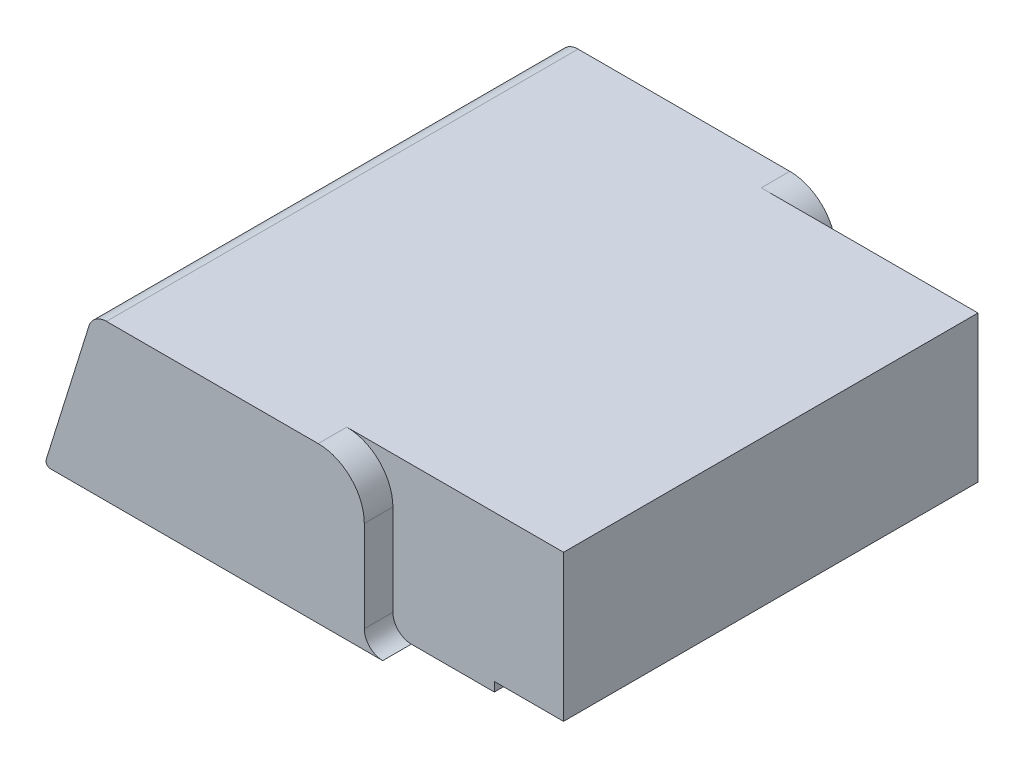
ISO-10303-21;
HEADER;
FILE_DESCRIPTION(('STEP AP214'),'2;1');
FILE_NAME('part.step','',(''),(''),'','','');
FILE_SCHEMA(('AUTOMOTIVE_DESIGN { 1 0 10303 214 1 1 1 1 }'));
ENDSEC;
DATA;
#1=APPLICATION_CONTEXT('core data for automotive mechanical design processes');
#2=APPLICATION_PROTOCOL_DEFINITION('international standard','automotive_design',2000,#1);
#3=PRODUCT_CONTEXT('',#1,'mechanical');
#4=PRODUCT('Part','Part','',(#3));
#5=PRODUCT_RELATED_PRODUCT_CATEGORY('part','',(#4));
#6=PRODUCT_DEFINITION_FORMATION('','',#4);
#7=PRODUCT_DEFINITION_CONTEXT('part definition',#1,'design');
#8=PRODUCT_DEFINITION('design','',#6,#7);
#9=PRODUCT_DEFINITION_SHAPE('','',#8);
#10=(LENGTH_UNIT() NAMED_UNIT(*) SI_UNIT(.MILLI.,.METRE.));
#11=(NAMED_UNIT(*) PLANE_ANGLE_UNIT() SI_UNIT($,.RADIAN.));
#12=(NAMED_UNIT(*) SI_UNIT($,.STERADIAN.) SOLID_ANGLE_UNIT());
#13=UNCERTAINTY_MEASURE_WITH_UNIT(LENGTH_MEASURE(1.E-05),#10,'distance_accuracy_value','');
#14=(GEOMETRIC_REPRESENTATION_CONTEXT(3) GLOBAL_UNCERTAINTY_ASSIGNED_CONTEXT((#13)) GLOBAL_UNIT_ASSIGNED_CONTEXT((#10,
#11,#12)) REPRESENTATION_CONTEXT('',''));
#15=CARTESIAN_POINT('',(0.,0.,0.));
#16=DIRECTION('',(0.,0.,1.));
#17=DIRECTION('',(1.,0.,0.));
#18=AXIS2_PLACEMENT_3D('',#15,#16,#17);
#19=CARTESIAN_POINT('',(-101.281474123743,-37.0815724734744,164.417656484885));
#20=CARTESIAN_POINT('',(-101.281474123743,-37.2137601819587,164.417656484885));
#21=CARTESIAN_POINT('',(-101.268497838334,-37.3437382004866,164.417656612879));
#22=CARTESIAN_POINT('',(-101.217653693146,-37.599455461755,164.417657114393));
#23=CARTESIAN_POINT('',(-101.179167805095,-37.7265205122736,164.417657494007));
#24=CARTESIAN_POINT('',(-101.078697982365,-37.9688073408026,164.417658485015));
#25=CARTESIAN_POINT('',(-101.017216946003,-38.0837169453513,164.417659091448));
#26=CARTESIAN_POINT('',(-100.871965630186,-38.3011763139347,164.417660524168));
#27=CARTESIAN_POINT('',(-100.787426051706,-38.4041223533585,164.417661358044));
#28=CARTESIAN_POINT('',(-100.510489943117,-38.6808339691759,164.417664089669));
#29=CARTESIAN_POINT('',(-100.287293627809,-38.8297238628878,164.417666291218));
#30=CARTESIAN_POINT('',(-99.8065075250648,-39.0288901593599,164.417671033566));
#31=CARTESIAN_POINT('',(-99.544520672811,-39.0815724734744,164.417673617735));
#32=CARTESIAN_POINT('',(-99.2814751127898,-39.0815724734744,164.417676212346));
#33=B_SPLINE_CURVE_WITH_KNOTS('',3,(#19,#20,#21,#22,#23,#24,#25,#26,#27,#28,#29,#30,#31,#32),
.UNSPECIFIED.,.F.,.F.,(4,2,2,2,2,2,4),(0.,0.125000000000002,0.250000000000005,0.375000000000007,
0.500000000000009,0.750000000000005,1.),.UNSPECIFIED.);
#34=DIRECTION('',(9.86373575134302E-06,0.,-0.999999999951353));
#35=VECTOR('',#34,1.);
#36=SURFACE_OF_LINEAR_EXTRUSION('',#33,#35);
#37=CARTESIAN_POINT('',(-99.2806044038107,-39.0815724734744,76.1439226375923));
#38=CARTESIAN_POINT('',(-99.3367784168037,-39.0815715984318,76.1439226375924));
#39=CARTESIAN_POINT('',(-99.3929471010851,-39.0791697772027,76.1439226375924));
#40=CARTESIAN_POINT('',(-99.5048902738677,-39.0696491265794,76.1439226375924));
#41=CARTESIAN_POINT('',(-99.5606647180303,-39.0625297748922,76.1439226375924));
#42=CARTESIAN_POINT('',(-99.6713546085651,-39.0436706820507,76.1439226375924));
#43=CARTESIAN_POINT('',(-99.7262710340785,-39.0319366794698,76.1439226375924));
#44=CARTESIAN_POINT('',(-99.834929594132,-39.0039271506319,76.1439226375923));
#45=CARTESIAN_POINT('',(-99.88867181901,-38.987651975089,76.1439226375923));
#46=CARTESIAN_POINT('',(-99.9946258689772,-38.9506075506168,76.1439226375923));
#47=CARTESIAN_POINT('',(-100.046836696861,-38.9298354440736,76.1439226375923));
#48=CARTESIAN_POINT('',(-100.149286783876,-38.8838922989977,76.1439226375924));
#49=CARTESIAN_POINT('',(-100.199525957019,-38.8587210688703,76.1439226375924));
#50=CARTESIAN_POINT('',(-100.29773897228,-38.8042714427134,76.1439226375924));
#51=CARTESIAN_POINT('',(-100.345712302541,-38.7749921245376,76.1439226375924));
#52=CARTESIAN_POINT('',(-100.43906449087,-38.7125540074626,76.1439226375923));
#53=CARTESIAN_POINT('',(-100.484443241201,-38.679395047639,76.1439226375923));
#54=CARTESIAN_POINT('',(-100.577030285781,-38.6056169910822,76.1439226375923));
#55=CARTESIAN_POINT('',(-100.62390632032,-38.5645789451913,76.1439226375923));
#56=CARTESIAN_POINT('',(-100.713535178313,-38.4782185877929,76.1439226375924));
#57=CARTESIAN_POINT('',(-100.756287491258,-38.4328957472098,76.1439226375924));
#58=CARTESIAN_POINT('',(-100.837439567959,-38.338509501545,76.1439226375924));
#59=CARTESIAN_POINT('',(-100.875839507396,-38.2894462475764,76.1439226375924));
#60=CARTESIAN_POINT('',(-100.947891403954,-38.1879421548522,76.1439226375924));
#61=CARTESIAN_POINT('',(-100.981541988551,-38.135500346074,76.1439226375923));
#62=CARTESIAN_POINT('',(-101.068887837804,-37.9842031491238,76.1439226375923));
#63=CARTESIAN_POINT('',(-101.11689395935,-37.8819892549647,76.1439226375924));
#64=CARTESIAN_POINT('',(-101.195024336623,-37.6710846905227,76.1439226375923));
#65=CARTESIAN_POINT('',(-101.22516959918,-37.5624017949772,76.1439226375923));
#66=CARTESIAN_POINT('',(-101.257519046321,-37.3909555321711,76.1439226375923));
#67=CARTESIAN_POINT('',(-101.266188972902,-37.3293502797344,76.1439226375924));
#68=CARTESIAN_POINT('',(-101.277739115154,-37.2056963047241,76.1439226375924));
#69=CARTESIAN_POINT('',(-101.280628304866,-37.1436484198286,76.1439226375923));
#70=CARTESIAN_POINT('',(-101.280603414959,-37.0815724734744,76.1439226375922));
#71=B_SPLINE_CURVE_WITH_KNOTS('',3,(#37,#38,#39,#40,#41,#42,#43,#44,#45,#46,#47,#48,#49,#50,#51,
#52,#53,#54,#55,#56,#57,#58,#59,#60,#61,#62,#63,#64,#65,#66,#67,#68,#69,#70),.UNSPECIFIED.,.F.,
.F.,(4,2,2,2,2,2,2,2,2,2,2,2,2,2,2,2,4),(0.,0.168463527425726,0.336945709105961,
0.505219033042758,0.673479364849754,0.84184693464676,1.01022183916789,1.17863459960835,
1.34705434815637,1.5336751012885,1.7203189280555,1.90695521838587,2.09364533506382,
2.43072316860925,2.76740376115721,2.95379652718704,3.13989971108254),.UNSPECIFIED.);
#72=CARTESIAN_POINT('',(-99.2806044038107,-39.0815724734744,76.1439226375924));
#73=VERTEX_POINT('',#72);
#74=CARTESIAN_POINT('',(-101.280603414978,-37.0815724734744,76.1439226375924));
#75=VERTEX_POINT('',#74);
#76=EDGE_CURVE('E165',#73,#75,#71,.T.);
#77=ORIENTED_EDGE('',*,*,#76,.F.);
#78=DIRECTION('',(9.86373575134302E-06,0.,-0.999999999951353));
#79=VECTOR('',#78,1.);
#80=CARTESIAN_POINT('',(-99.2814751127898,-39.0815724734744,164.417676212346));
#81=LINE('',#80,#79);
#82=CARTESIAN_POINT('',(-99.2805738258406,-39.0815724734744,73.043883173301));
#83=VERTEX_POINT('',#82);
#84=EDGE_CURVE('E39',#73,#83,#81,.T.);
#85=ORIENTED_EDGE('',*,*,#84,.T.);
#86=CARTESIAN_POINT('',(-101.280572837378,-37.0815724734744,73.0439226282245));
#87=CARTESIAN_POINT('',(-101.280591551886,-37.1378284980693,73.0439226285937));
#88=CARTESIAN_POINT('',(-101.278222042697,-37.1940598038379,73.0439225818493));
#89=CARTESIAN_POINT('',(-101.268745643697,-37.3061154827762,73.0439223949039));
#90=CARTESIAN_POINT('',(-101.261639292978,-37.3619399015224,73.0439222547136));
#91=CARTESIAN_POINT('',(-101.233301660917,-37.5281164219867,73.0439216956837));
#92=CARTESIAN_POINT('',(-101.205051597739,-37.6373459178312,73.0439211383814));
#93=CARTESIAN_POINT('',(-101.130632392638,-37.8495893692544,73.0439196702787));
#94=CARTESIAN_POINT('',(-101.084453857574,-37.9526000338991,73.0439187592929));
#95=CARTESIAN_POINT('',(-101.002748687609,-38.1000914256358,73.0439171474565));
#96=CARTESIAN_POINT('',(-100.973429434884,-38.1480986006943,73.0439165690618));
#97=CARTESIAN_POINT('',(-100.91082276536,-38.2414700848887,73.0439153339905));
#98=CARTESIAN_POINT('',(-100.877535129304,-38.2868342477886,73.0439146773096));
#99=CARTESIAN_POINT('',(-100.807350677536,-38.3745868911596,73.0439132927478));
#100=CARTESIAN_POINT('',(-100.770458165198,-38.4169788183636,73.0439125649519));
#101=CARTESIAN_POINT('',(-100.693205085952,-38.4984727556882,73.0439110409439));
#102=CARTESIAN_POINT('',(-100.652844810534,-38.5375750417807,73.0439102447378));
#103=CARTESIAN_POINT('',(-100.568932693656,-38.6122112425541,73.0439085893639));
#104=CARTESIAN_POINT('',(-100.525380184739,-38.6477444072719,73.043907730183));
#105=CARTESIAN_POINT('',(-100.435486350699,-38.7150665989496,73.0439059568049));
#106=CARTESIAN_POINT('',(-100.38914472741,-38.7468552245257,73.0439050426019));
#107=CARTESIAN_POINT('',(-100.24610960078,-38.8364513125397,73.0439022208805));
#108=CARTESIAN_POINT('',(-100.145589476334,-38.8883262298092,73.0439002378726));
#109=CARTESIAN_POINT('',(-99.9372394287887,-38.9740727999361,73.043896127653));
#110=CARTESIAN_POINT('',(-99.8294140727153,-39.0079555859781,73.0438940005313));
#111=CARTESIAN_POINT('',(-99.6475498627048,-39.0488359712398,73.0438904128103));
#112=CARTESIAN_POINT('',(-99.5746438881906,-39.061072150641,73.0438889745598));
#113=CARTESIAN_POINT('',(-99.4280311750876,-39.0774322083513,73.0438860822617));
#114=CARTESIAN_POINT('',(-99.3543256832973,-39.0815672817259,73.0438846282387));
#115=CARTESIAN_POINT('',(-99.2805738258406,-39.0815724734744,73.043883173301));
#116=B_SPLINE_CURVE_WITH_KNOTS('',3,(#86,#87,#88,#89,#90,#91,#92,#93,#94,#95,#96,#97,#98,#99,
#100,#101,#102,#103,#104,#105,#106,#107,#108,#109,#110,#111,#112,#113,#114,#115),.UNSPECIFIED.,
.F.,.F.,(4,2,2,2,2,2,2,2,2,2,2,2,2,2,4),(0.,0.16866740805359,0.337315623609325,
0.674096401412206,1.01105386510752,1.17963983209892,1.34823511798416,1.51663154413684,
1.68501382920234,1.85343142197454,2.02186705132782,2.35946555505979,2.69685491518546,
2.91821729875072,3.13927356123856),.UNSPECIFIED.);
#117=CARTESIAN_POINT('',(-101.280572837378,-37.0815724734744,73.0439226282245));
#118=VERTEX_POINT('',#117);
#119=EDGE_CURVE('E312',#118,#83,#116,.T.);
#120=ORIENTED_EDGE('',*,*,#119,.F.);
#121=DIRECTION('',(9.86373575134302E-06,0.,-0.999999999951353));
#122=VECTOR('',#121,1.);
#123=CARTESIAN_POINT('',(-101.281474123743,-37.0815724734744,164.417656484885));
#124=LINE('',#123,#122);
#125=EDGE_CURVE('E229',#75,#118,#124,.T.);
#126=ORIENTED_EDGE('',*,*,#125,.F.);
#127=EDGE_LOOP('',(#77,#85,#120,#126));
#128=FACE_BOUND('',#127,.T.);
#129=ADVANCED_FACE('F34',(#128),#36,.T.);
#130=CARTESIAN_POINT('',(-99.2810782801631,-39.0815724734744,124.186202385294));
#131=VERTEX_POINT('',#130);
#132=CARTESIAN_POINT('',(-99.2810477021931,-39.0815724734744,121.086162930955));
#133=VERTEX_POINT('',#132);
#134=EDGE_CURVE('E11',#131,#133,#81,.T.);
#135=ORIENTED_EDGE('',*,*,#134,.T.);
#136=CARTESIAN_POINT('',(-101.281046713341,-37.0815724734744,121.086162930955));
#137=CARTESIAN_POINT('',(-101.281061455031,-37.1379580621076,121.086162930955));
#138=CARTESIAN_POINT('',(-101.278683586771,-37.1943083801505,121.086162930955));
#139=CARTESIAN_POINT('',(-101.269170443406,-37.3065929282094,121.086162930955));
#140=CARTESIAN_POINT('',(-101.262036262112,-37.3625272509022,121.086162930955));
#141=CARTESIAN_POINT('',(-101.233648036763,-37.5285910338924,121.086162930955));
#142=CARTESIAN_POINT('',(-101.205407546185,-37.6376341765897,121.086162930955));
#143=CARTESIAN_POINT('',(-101.147776211288,-37.8020733538312,121.086162930955));
#144=CARTESIAN_POINT('',(-101.124507692428,-37.8597191749958,121.086162930955));
#145=CARTESIAN_POINT('',(-101.072699083393,-37.9725846549784,121.086162930955));
#146=CARTESIAN_POINT('',(-101.044161624985,-38.0278055080653,121.086162930955));
#147=CARTESIAN_POINT('',(-100.984969624252,-38.1303267475353,121.086162930955));
#148=CARTESIAN_POINT('',(-100.954760500059,-38.1778855887363,121.086162930955));
#149=CARTESIAN_POINT('',(-100.890426828055,-38.2702504736213,121.086162930955));
#150=CARTESIAN_POINT('',(-100.856303786033,-38.3150575658572,121.086162930955));
#151=CARTESIAN_POINT('',(-100.784412048263,-38.4017505236711,121.086162930955));
#152=CARTESIAN_POINT('',(-100.746638367475,-38.4436322563143,121.086162930955));
#153=CARTESIAN_POINT('',(-100.667626237382,-38.5239901848533,121.086162930955));
#154=CARTESIAN_POINT('',(-100.626387909447,-38.5624664999461,121.086162930955));
#155=CARTESIAN_POINT('',(-100.540840455105,-38.6357553170281,121.086162930955));
#156=CARTESIAN_POINT('',(-100.496533967709,-38.6705709043556,121.086162930955));
#157=CARTESIAN_POINT('',(-100.405175122868,-38.7363958778078,121.086162930955));
#158=CARTESIAN_POINT('',(-100.358122570284,-38.767404992953,121.086162930955));
#159=CARTESIAN_POINT('',(-100.261599086631,-38.8253978829221,121.086162930955));
#160=CARTESIAN_POINT('',(-100.21212825045,-38.8523818155177,121.086162930955));
#161=CARTESIAN_POINT('',(-100.111072777626,-38.9020445775167,121.086162930955));
#162=CARTESIAN_POINT('',(-100.0594882558,-38.9247236403887,121.086162930955));
#163=CARTESIAN_POINT('',(-99.9494061731288,-38.9675887163006,121.086162930955));
#164=CARTESIAN_POINT('',(-99.8907274554824,-38.9873106478254,121.086162930955));
#165=CARTESIAN_POINT('',(-99.771793843033,-39.021272171522,121.086162930955));
#166=CARTESIAN_POINT('',(-99.7115385644085,-39.0355104151482,121.086162930955));
#167=CARTESIAN_POINT('',(-99.5898396488519,-39.0584162841965,121.086162930955));
#168=CARTESIAN_POINT('',(-99.5283937013892,-39.0670716598539,121.086162930955));
#169=CARTESIAN_POINT('',(-99.4049832291879,-39.0786480174476,121.086162930955));
#170=CARTESIAN_POINT('',(-99.3430188624887,-39.0815706872985,121.086162930955));
#171=CARTESIAN_POINT('',(-99.2810477021931,-39.0815724734744,121.086162930955));
#172=B_SPLINE_CURVE_WITH_KNOTS('',3,(#136,#137,#138,#139,#140,#141,#142,#143,#144,#145,#146,
#147,#148,#149,#150,#151,#152,#153,#154,#155,#156,#157,#158,#159,#160,#161,#162,#163,#164,#165,
#166,#167,#168,#169,#170,#171),.UNSPECIFIED.,.F.,.F.,(4,2,2,2,2,2,2,2,2,2,2,2,2,2,2,2,2,4),(0.,
0.16903466432875,0.338030469098644,0.674087559292093,0.860368064283544,1.04655577513584,
1.21538521626237,1.38414992070079,1.55314842443163,1.72214101050377,1.89099000470998,
2.05985101216667,2.22870539917704,2.39755062598655,2.58299016701654,2.76847528217141,
2.95436601117895,3.140201999054),.UNSPECIFIED.);
#173=CARTESIAN_POINT('',(-101.281046713341,-37.0815724734744,121.086162930955));
#174=VERTEX_POINT('',#173);
#175=EDGE_CURVE('E52',#174,#133,#172,.T.);
#176=ORIENTED_EDGE('',*,*,#175,.F.);
#177=CARTESIAN_POINT('',(-101.281077290922,-37.0815724734744,124.186162930371));
#178=VERTEX_POINT('',#177);
#179=EDGE_CURVE('E222',#178,#174,#124,.T.);
#180=ORIENTED_EDGE('',*,*,#179,.F.);
#181=CARTESIAN_POINT('',(-101.281077290922,-37.0815724734744,124.186162930371));
#182=CARTESIAN_POINT('',(-101.28109600543,-37.1378284980853,124.186162930002));
#183=CARTESIAN_POINT('',(-101.278726496241,-37.1940598038698,124.186162976746));
#184=CARTESIAN_POINT('',(-101.269250097239,-37.3061154828401,124.186163163692));
#185=CARTESIAN_POINT('',(-101.262143746519,-37.3619399016023,124.186163303882));
#186=CARTESIAN_POINT('',(-101.233806114452,-37.5281164221156,124.186163862912));
#187=CARTESIAN_POINT('',(-101.205556051268,-37.6373459179929,124.186164420214));
#188=CARTESIAN_POINT('',(-101.131136846149,-37.8495893694807,124.186165888317));
#189=CARTESIAN_POINT('',(-101.084958311073,-37.952600034157,124.186166799303));
#190=CARTESIAN_POINT('',(-101.003253141084,-38.1000914259379,124.186168411139));
#191=CARTESIAN_POINT('',(-100.973933888349,-38.1480986010105,124.186168989534));
#192=CARTESIAN_POINT('',(-100.911327218805,-38.2414700852315,124.186170224605));
#193=CARTESIAN_POINT('',(-100.878039582737,-38.2868342481439,124.186170881286));
#194=CARTESIAN_POINT('',(-100.807855130951,-38.3745868915306,124.186172265848));
#195=CARTESIAN_POINT('',(-100.770962618605,-38.4169788187383,124.186172993644));
#196=CARTESIAN_POINT('',(-100.693709539344,-38.4984727560684,124.186174517652));
#197=CARTESIAN_POINT('',(-100.653349263917,-38.5375750421625,124.186175313858));
#198=CARTESIAN_POINT('',(-100.569437147022,-38.6122112429375,124.186176969232));
#199=CARTESIAN_POINT('',(-100.525884638094,-38.6477444076552,124.186177828412));
#200=CARTESIAN_POINT('',(-100.435990804034,-38.7150665993301,124.186179601791));
#201=CARTESIAN_POINT('',(-100.389649180734,-38.7468552249036,124.186180515994));
#202=CARTESIAN_POINT('',(-100.246614054105,-38.8364513128823,124.186183337715));
#203=CARTESIAN_POINT('',(-100.146093929674,-38.8883262301196,124.186185320723));
#204=CARTESIAN_POINT('',(-99.9377438821586,-38.9740728001782,124.186189430942));
#205=CARTESIAN_POINT('',(-99.8299185261023,-39.0079555861842,124.186191558064));
#206=CARTESIAN_POINT('',(-99.6480543162584,-39.0488359713518,124.186195145785));
#207=CARTESIAN_POINT('',(-99.5751483418955,-39.0610721507112,124.186196584036));
#208=CARTESIAN_POINT('',(-99.4285356290992,-39.0774322083656,124.186199476334));
#209=CARTESIAN_POINT('',(-99.3548301374643,-39.081567281726,124.186200930357));
#210=CARTESIAN_POINT('',(-99.2810782801631,-39.0815724734744,124.186202385294));
#211=B_SPLINE_CURVE_WITH_KNOTS('',3,(#181,#182,#183,#184,#185,#186,#187,#188,#189,#190,#191,
#192,#193,#194,#195,#196,#197,#198,#199,#200,#201,#202,#203,#204,#205,#206,#207,#208,#209,#210),
.UNSPECIFIED.,.F.,.F.,(4,2,2,2,2,2,2,2,2,2,2,2,2,2,4),(0.,0.168667408101488,0.337315623705283,
0.674096401607688,1.01105386540394,1.17963983244546,1.34823511838077,1.51663154455538,
1.68501382964285,1.85343142243693,2.02186705181199,2.35946555546313,2.6968549155062,
2.91821729860526,3.13927356062733),.UNSPECIFIED.);
#212=EDGE_CURVE('E228',#178,#131,#211,.T.);
#213=ORIENTED_EDGE('',*,*,#212,.T.);
#214=EDGE_LOOP('',(#135,#176,#180,#213));
#215=FACE_BOUND('',#214,.T.);
#216=ADVANCED_FACE('F372',(#215),#36,.T.);
#217=CARTESIAN_POINT('',(-500000.,-38.0815724733593,76.1439226375924));
#218=DIRECTION('',(0.,1.,0.));
#219=DIRECTION('',(-1.,0.,0.));
#220=AXIS2_PLACEMENT_3D('',#217,#218,#219);
#221=PLANE('',#220);
#222=DIRECTION('',(0.,0.,1.));
#223=VECTOR('',#222,1.);
#224=CARTESIAN_POINT('',(-90.2801275672213,-38.0815724734744,121.086162930955));
#225=LINE('',#224,#223);
#226=CARTESIAN_POINT('',(-90.2801275672213,-38.0815724734744,76.1439226375924));
#227=VERTEX_POINT('',#226);
#228=CARTESIAN_POINT('',(-90.2801275673255,-38.0815724734744,121.086162930955));
#229=VERTEX_POINT('',#228);
#230=EDGE_CURVE('E59',#227,#229,#225,.T.);
#231=ORIENTED_EDGE('',*,*,#230,.F.);
#232=DIRECTION('',(1.,0.,0.));
#233=VECTOR('',#232,1.);
#234=CARTESIAN_POINT('',(-500000.,-38.0815724733593,76.1439226375924));
#235=LINE('',#234,#233);
#236=CARTESIAN_POINT('',(-82.7730874144749,-38.0815724734744,76.1439226375924));
#237=VERTEX_POINT('',#236);
#238=EDGE_CURVE('E332',#227,#237,#235,.T.);
#239=ORIENTED_EDGE('',*,*,#238,.T.);
#240=DIRECTION('',(0.,0.,1.));
#241=VECTOR('',#240,1.);
#242=CARTESIAN_POINT('',(-82.7730874144749,-38.0815724734744,76.1439226375924));
#243=LINE('',#242,#241);
#244=CARTESIAN_POINT('',(-82.7730874144749,-38.0815724734744,121.086162930955));
#245=VERTEX_POINT('',#244);
#246=EDGE_CURVE('E319',#237,#245,#243,.T.);
#247=ORIENTED_EDGE('',*,*,#246,.T.);
#248=DIRECTION('',(1.,0.,0.));
#249=VECTOR('',#248,1.);
#250=CARTESIAN_POINT('',(-500000.,-38.0815724733593,121.086162930955));
#251=LINE('',#250,#249);
#252=EDGE_CURVE('E334',#229,#245,#251,.T.);
#253=ORIENTED_EDGE('',*,*,#252,.F.);
#254=EDGE_LOOP('',(#231,#239,#247,#253));
#255=FACE_BOUND('',#254,.T.);
#256=ADVANCED_FACE('F347',(#255),#221,.F.);
#257=CARTESIAN_POINT('',(-106.281474123257,-27.1975919594193,164.417607166206));
#258=DIRECTION('',(9.86373575134302E-06,0.,-0.999999999951353));
#259=DIRECTION('',(-0.999999999951353,0.,-9.86373575134302E-06));
#260=AXIS2_PLACEMENT_3D('',#257,#258,#259);
#261=CYLINDRICAL_SURFACE('',#260,4.99999999987836);
#262=DIRECTION('',(9.86373575134302E-06,0.,-0.999999999951353));
#263=VECTOR('',#262,1.);
#264=CARTESIAN_POINT('',(-106.281474123257,-22.1975919594194,164.417607166206));
#265=LINE('',#264,#263);
#266=CARTESIAN_POINT('',(-106.280603414881,-22.1975919594194,76.1439226375924));
#267=VERTEX_POINT('',#266);
#268=CARTESIAN_POINT('',(-106.280572838351,-22.1975919594194,73.0440212655821));
#269=VERTEX_POINT('',#268);
#270=EDGE_CURVE('E265',#267,#269,#265,.T.);
#271=ORIENTED_EDGE('',*,*,#270,.F.);
#272=CARTESIAN_POINT('',(-106.280603414959,-27.1975919594193,76.1439226375924));
#273=DIRECTION('',(0.,0.,1.));
#274=DIRECTION('',(1.,-2.11044783964569E-12,0.));
#275=AXIS2_PLACEMENT_3D('',#272,#273,#274);
#276=ELLIPSE('',#275,5.00000000012159,4.99999999987836);
#277=CARTESIAN_POINT('',(-101.280603414959,-27.1975919594194,76.1439226375924));
#278=VERTEX_POINT('',#277);
#279=EDGE_CURVE('E204',#278,#267,#276,.T.);
#280=ORIENTED_EDGE('',*,*,#279,.F.);
#281=DIRECTION('',(9.86373575134302E-06,0.,-0.999999999951353));
#282=VECTOR('',#281,1.);
#283=CARTESIAN_POINT('',(-101.281474123743,-27.1975919594194,164.417656484885));
#284=LINE('',#283,#282);
#285=CARTESIAN_POINT('',(-101.280572837378,-27.1975919594194,73.0439226282245));
#286=VERTEX_POINT('',#285);
#287=EDGE_CURVE('E251',#278,#286,#284,.T.);
#288=ORIENTED_EDGE('',*,*,#287,.T.);
#289=CARTESIAN_POINT('',(-106.280572838351,-27.1975919594193,73.0440212655821));
#290=DIRECTION('',(-1.97274715017264E-05,0.,-0.999999999805413));
#291=DIRECTION('',(-0.999999999805413,0.,1.97274715017264E-05));
#292=AXIS2_PLACEMENT_3D('',#289,#290,#291);
#293=ELLIPSE('',#292,5.00000000206746,4.99999999987837);
#294=EDGE_CURVE('E288',#269,#286,#293,.T.);
#295=ORIENTED_EDGE('',*,*,#294,.F.);
#296=EDGE_LOOP('',(#271,#280,#288,#295));
#297=FACE_BOUND('',#296,.T.);
#298=ADVANCED_FACE('F363',(#297),#261,.T.);
#299=CARTESIAN_POINT('',(-101.281077290922,-27.1975919594194,124.186162930371));
#300=VERTEX_POINT('',#299);
#301=CARTESIAN_POINT('',(-101.281046713341,-27.1975919594194,121.086162930955));
#302=VERTEX_POINT('',#301);
#303=EDGE_CURVE('E246',#300,#302,#284,.T.);
#304=ORIENTED_EDGE('',*,*,#303,.T.);
#305=CARTESIAN_POINT('',(-106.281046713341,-27.1975919594193,121.086162930955));
#306=DIRECTION('',(0.,0.,-1.));
#307=DIRECTION('',(1.,-2.11044783964569E-12,0.));
#308=AXIS2_PLACEMENT_3D('',#305,#306,#307);
#309=ELLIPSE('',#308,5.00000000012159,4.99999999987836);
#310=CARTESIAN_POINT('',(-106.281046713274,-22.1975919594194,121.086162930955));
#311=VERTEX_POINT('',#310);
#312=EDGE_CURVE('E195',#311,#302,#309,.T.);
#313=ORIENTED_EDGE('',*,*,#312,.F.);
#314=CARTESIAN_POINT('',(-106.281077289949,-22.1975919594194,124.186064293013));
#315=VERTEX_POINT('',#314);
#316=EDGE_CURVE('E261',#315,#311,#265,.T.);
#317=ORIENTED_EDGE('',*,*,#316,.F.);
#318=CARTESIAN_POINT('',(-106.281077289949,-27.1975919594193,124.186064293013));
#319=DIRECTION('',(-1.97274715017264E-05,0.,0.999999999805413));
#320=DIRECTION('',(-0.999999999805413,0.,-1.97274715017264E-05));
#321=AXIS2_PLACEMENT_3D('',#318,#319,#320);
#322=ELLIPSE('',#321,5.00000000012159,4.99999999987836);
#323=EDGE_CURVE('E258',#315,#300,#322,.F.);
#324=ORIENTED_EDGE('',*,*,#323,.T.);
#325=EDGE_LOOP('',(#304,#313,#317,#324));
#326=FACE_BOUND('',#325,.T.);
#327=ADVANCED_FACE('F365',(#326),#261,.T.);
#328=CARTESIAN_POINT('',(-101.281474123743,-37.0815724734744,164.417656484885));
#329=DIRECTION('',(0.999999999951353,0.,9.86373575134302E-06));
#330=DIRECTION('',(9.86373575134302E-06,0.,-0.999999999951353));
#331=AXIS2_PLACEMENT_3D('',#328,#329,#330);
#332=PLANE('',#331);
#333=ORIENTED_EDGE('',*,*,#287,.F.);
#334=DIRECTION('',(0.,1.,0.));
#335=VECTOR('',#334,1.);
#336=CARTESIAN_POINT('',(-101.280603414978,-22.1975919593043,76.1439226375924));
#337=LINE('',#336,#335);
#338=EDGE_CURVE('E167',#75,#278,#337,.T.);
#339=ORIENTED_EDGE('',*,*,#338,.F.);
#340=ORIENTED_EDGE('',*,*,#125,.T.);
#341=DIRECTION('',(0.,-1.,0.));
#342=VECTOR('',#341,1.);
#343=CARTESIAN_POINT('',(-101.280572837378,-37.0815724734744,73.0439226282245));
#344=LINE('',#343,#342);
#345=EDGE_CURVE('E221',#286,#118,#344,.T.);
#346=ORIENTED_EDGE('',*,*,#345,.F.);
#347=EDGE_LOOP('',(#333,#339,#340,#346));
#348=FACE_BOUND('',#347,.T.);
#349=ADVANCED_FACE('F350',(#348),#332,.T.);
#350=ORIENTED_EDGE('',*,*,#179,.T.);
#351=DIRECTION('',(0.,-1.,0.));
#352=VECTOR('',#351,1.);
#353=CARTESIAN_POINT('',(-101.281046713382,-38.0815724733593,121.086162930955));
#354=LINE('',#353,#352);
#355=EDGE_CURVE('E203',#302,#174,#354,.T.);
#356=ORIENTED_EDGE('',*,*,#355,.F.);
#357=ORIENTED_EDGE('',*,*,#303,.F.);
#358=DIRECTION('',(0.,-1.,0.));
#359=VECTOR('',#358,1.);
#360=CARTESIAN_POINT('',(-101.281077290922,-37.0815724734744,124.186162930371));
#361=LINE('',#360,#359);
#362=EDGE_CURVE('E239',#300,#178,#361,.T.);
#363=ORIENTED_EDGE('',*,*,#362,.T.);
#364=EDGE_LOOP('',(#350,#356,#357,#363));
#365=FACE_BOUND('',#364,.T.);
#366=ADVANCED_FACE('F382',(#365),#332,.T.);
#367=CARTESIAN_POINT('',(-137.706438472426,-51.4263962068436,124.185444350096));
#368=DIRECTION('',(-1.97274715017264E-05,0.,0.999999999805413));
#369=DIRECTION('',(0.,1.,0.));
#370=AXIS2_PLACEMENT_3D('',#367,#368,#369);
#371=PLANE('',#370);
#372=ORIENTED_EDGE('',*,*,#212,.F.);
#373=ORIENTED_EDGE('',*,*,#362,.F.);
#374=ORIENTED_EDGE('',*,*,#323,.F.);
#375=DIRECTION('',(0.999999999805413,0.,1.97274715017264E-05));
#376=VECTOR('',#375,1.);
#377=CARTESIAN_POINT('',(-106.280680456641,-22.1975919594194,124.186064300842));
#378=LINE('',#377,#376);
#379=CARTESIAN_POINT('',(-129.239691101174,-22.1975919594194,124.185611377614));
#380=VERTEX_POINT('',#379);
#381=EDGE_CURVE('E262',#380,#315,#378,.T.);
#382=ORIENTED_EDGE('',*,*,#381,.F.);
#383=CARTESIAN_POINT('',(-129.239691101174,-24.1975919593614,124.185611377614));
#384=DIRECTION('',(-1.97274715017264E-05,0.,0.999999999805413));
#385=DIRECTION('',(-0.999999999805413,0.,-1.97274715017264E-05));
#386=AXIS2_PLACEMENT_3D('',#383,#384,#385);
#387=ELLIPSE('',#386,2.00000000001539,1.9999999999181);
#388=CARTESIAN_POINT('',(-131.148936290385,-23.6019554880246,124.185573713034));
#389=VERTEX_POINT('',#388);
#390=EDGE_CURVE('E267',#389,#380,#387,.F.);
#391=ORIENTED_EDGE('',*,*,#390,.F.);
#392=DIRECTION('',(0.297818235639428,0.954622594791313,5.87520075739461E-06));
#393=VECTOR('',#392,1.);
#394=CARTESIAN_POINT('',(-131.148901092762,-23.6018426660333,124.185573713728));
#395=LINE('',#394,#393);
#396=CARTESIAN_POINT('',(-135.775744072344,-38.4326633556323,124.185482437815));
#397=VERTEX_POINT('',#396);
#398=EDGE_CURVE('E271',#397,#389,#395,.T.);
#399=ORIENTED_EDGE('',*,*,#398,.F.);
#400=CARTESIAN_POINT('',(-135.298432775016,-38.5815724734744,124.18549185396));
#401=DIRECTION('',(-1.97274715017264E-05,0.,0.999999999805413));
#402=DIRECTION('',(0.999999999805413,0.,1.97274715017264E-05));
#403=AXIS2_PLACEMENT_3D('',#400,#401,#402);
#404=CIRCLE('',#403,0.500000000000027);
#405=CARTESIAN_POINT('',(-135.298432775016,-39.0815724734744,124.18549185396));
#406=VERTEX_POINT('',#405);
#407=EDGE_CURVE('E275',#406,#397,#404,.F.);
#408=ORIENTED_EDGE('',*,*,#407,.F.);
#409=DIRECTION('',(-0.999999999805413,0.,-1.97274715017264E-05));
#410=VECTOR('',#409,1.);
#411=CARTESIAN_POINT('',(-135.298035938885,-39.0815724734744,124.185491861789));
#412=LINE('',#411,#410);
#413=EDGE_CURVE('E283',#131,#406,#412,.T.);
#414=ORIENTED_EDGE('',*,*,#413,.F.);
#415=EDGE_LOOP('',(#372,#373,#374,#382,#391,#399,#408,#414));
#416=FACE_BOUND('',#415,.T.);
#417=ADVANCED_FACE('F36',(#416),#371,.T.);
#418=CARTESIAN_POINT('',(-135.298829611147,-39.0815724734744,164.417320946679));
#419=DIRECTION('',(0.,-1.,0.));
#420=DIRECTION('',(0.,0.,-1.));
#421=AXIS2_PLACEMENT_3D('',#418,#419,#420);
#422=PLANE('',#421);
#423=ORIENTED_EDGE('',*,*,#84,.F.);
#424=DIRECTION('',(1.,0.,0.));
#425=VECTOR('',#424,1.);
#426=CARTESIAN_POINT('',(-99.6386250126137,-39.0815724734744,76.1439226375924));
#427=LINE('',#426,#425);
#428=CARTESIAN_POINT('',(-90.2801275672213,-39.0815724734744,76.1439226375924));
#429=VERTEX_POINT('',#428);
#430=EDGE_CURVE('E160',#73,#429,#427,.T.);
#431=ORIENTED_EDGE('',*,*,#430,.T.);
#432=DIRECTION('',(0.,0.,1.));
#433=VECTOR('',#432,1.);
#434=CARTESIAN_POINT('',(-90.2801275672213,-39.0815724734744,121.086162930955));
#435=LINE('',#434,#433);
#436=CARTESIAN_POINT('',(-90.2801275672213,-39.0815724734744,121.086162930955));
#437=VERTEX_POINT('',#436);
#438=EDGE_CURVE('E151',#429,#437,#435,.T.);
#439=ORIENTED_EDGE('',*,*,#438,.T.);
#440=DIRECTION('',(-1.,0.,0.));
#441=VECTOR('',#440,1.);
#442=CARTESIAN_POINT('',(-99.6386250126137,-39.0815724734744,121.086162930955));
#443=LINE('',#442,#441);
#444=EDGE_CURVE('E154',#437,#133,#443,.T.);
#445=ORIENTED_EDGE('',*,*,#444,.T.);
#446=ORIENTED_EDGE('',*,*,#134,.F.);
#447=ORIENTED_EDGE('',*,*,#413,.T.);
#448=DIRECTION('',(9.86373575134302E-06,0.,-0.999999999951353));
#449=VECTOR('',#448,1.);
#450=CARTESIAN_POINT('',(-135.298829611147,-39.0815724734744,164.417320946679));
#451=LINE('',#450,#449);
#452=CARTESIAN_POINT('',(-135.297928334711,-39.0815724734744,73.0445937046358));
#453=VERTEX_POINT('',#452);
#454=EDGE_CURVE('E277',#406,#453,#451,.T.);
#455=ORIENTED_EDGE('',*,*,#454,.T.);
#456=DIRECTION('',(-0.999999999805413,0.,1.97274715017264E-05));
#457=VECTOR('',#456,1.);
#458=CARTESIAN_POINT('',(-135.296737815951,-39.0815724734744,73.0445936811499));
#459=LINE('',#458,#457);
#460=EDGE_CURVE('E310',#83,#453,#459,.T.);
#461=ORIENTED_EDGE('',*,*,#460,.F.);
#462=EDGE_LOOP('',(#423,#431,#439,#445,#446,#447,#455,#461));
#463=FACE_BOUND('',#462,.T.);
#464=ADVANCED_FACE('F163',(#463),#422,.T.);
#465=CARTESIAN_POINT('',(-135.298829611147,-38.5815724734744,164.417320946679));
#466=DIRECTION('',(9.86373575134302E-06,0.,-0.999999999951353));
#467=DIRECTION('',(-0.999999999951353,0.,-9.86373575134302E-06));
#468=AXIS2_PLACEMENT_3D('',#465,#466,#467);
#469=CYLINDRICAL_SURFACE('',#468,0.500000000000027);
#470=ORIENTED_EDGE('',*,*,#454,.F.);
#471=ORIENTED_EDGE('',*,*,#407,.T.);
#472=DIRECTION('',(9.86373575134302E-06,0.,-0.999999999951353));
#473=VECTOR('',#472,1.);
#474=CARTESIAN_POINT('',(-135.776140908522,-38.4326633556323,164.417316238607));
#475=LINE('',#474,#473);
#476=CARTESIAN_POINT('',(-135.775239632225,-38.4326633556323,73.0446031207808));
#477=VERTEX_POINT('',#476);
#478=EDGE_CURVE('E274',#397,#477,#475,.T.);
#479=ORIENTED_EDGE('',*,*,#478,.T.);
#480=CARTESIAN_POINT('',(-135.297928334711,-38.5815724734744,73.0445937046358));
#481=DIRECTION('',(-1.97274715017264E-05,0.,-0.999999999805413));
#482=DIRECTION('',(-0.999999999805413,0.,1.97274715017264E-05));
#483=AXIS2_PLACEMENT_3D('',#480,#481,#482);
#484=ELLIPSE('',#483,0.500000000218937,0.500000000000027);
#485=EDGE_CURVE('E307',#453,#477,#484,.T.);
#486=ORIENTED_EDGE('',*,*,#485,.F.);
#487=EDGE_LOOP('',(#470,#471,#479,#486));
#488=FACE_BOUND('',#487,.T.);
#489=ADVANCED_FACE('F353',(#488),#469,.T.);
#490=CARTESIAN_POINT('',(-131.149333126112,-23.6019554880246,164.417361876216));
#491=DIRECTION('',(-0.954622594748993,0.297818235684177,-9.41614501732974E-06));
#492=DIRECTION('',(-0.29781823569738,-0.954622594791313,0.));
#493=AXIS2_PLACEMENT_3D('',#490,#491,#492);
#494=PLANE('',#493);
#495=ORIENTED_EDGE('',*,*,#478,.F.);
#496=ORIENTED_EDGE('',*,*,#398,.T.);
#497=DIRECTION('',(9.86373575134302E-06,0.,-0.999999999951353));
#498=VECTOR('',#497,1.);
#499=CARTESIAN_POINT('',(-131.149333126112,-23.6019554880246,164.417361876216));
#500=LINE('',#499,#498);
#501=CARTESIAN_POINT('',(-131.148431848464,-23.6019554880246,73.0445118455621));
#502=VERTEX_POINT('',#501);
#503=EDGE_CURVE('E270',#389,#502,#500,.T.);
#504=ORIENTED_EDGE('',*,*,#503,.T.);
#505=DIRECTION('',(0.297818235745051,0.954622594758362,-5.87520075951802E-06));
#506=VECTOR('',#505,1.);
#507=CARTESIAN_POINT('',(-131.14832625489,-23.6016170197918,73.044511843479));
#508=LINE('',#507,#506);
#509=EDGE_CURVE('E304',#477,#502,#508,.T.);
#510=ORIENTED_EDGE('',*,*,#509,.F.);
#511=EDGE_LOOP('',(#495,#496,#504,#510));
#512=FACE_BOUND('',#511,.T.);
#513=ADVANCED_FACE('F356',(#512),#494,.T.);
#514=CARTESIAN_POINT('',(-129.240087936715,-24.1975919593614,164.417380708506));
#515=DIRECTION('',(9.86373575134302E-06,0.,-0.999999999951353));
#516=DIRECTION('',(-0.999999999951353,0.,-9.86373575134302E-06));
#517=AXIS2_PLACEMENT_3D('',#514,#515,#516);
#518=CYLINDRICAL_SURFACE('',#517,1.9999999999181);
#519=ORIENTED_EDGE('',*,*,#503,.F.);
#520=ORIENTED_EDGE('',*,*,#390,.T.);
#521=DIRECTION('',(9.86373575134302E-06,0.,-0.999999999951353));
#522=VECTOR('',#521,1.);
#523=CARTESIAN_POINT('',(-129.240087936715,-22.1975919594194,164.417380708506));
#524=LINE('',#523,#522);
#525=CARTESIAN_POINT('',(-129.23918665851,-22.1975919594194,73.044474180982));
#526=VERTEX_POINT('',#525);
#527=EDGE_CURVE('E266',#380,#526,#524,.T.);
#528=ORIENTED_EDGE('',*,*,#527,.T.);
#529=CARTESIAN_POINT('',(-129.23918665851,-24.1975919593614,73.044474180982));
#530=DIRECTION('',(-1.97274715017264E-05,0.,-0.999999999805413));
#531=DIRECTION('',(-0.999999999805413,0.,1.97274715017264E-05));
#532=AXIS2_PLACEMENT_3D('',#529,#530,#531);
#533=ELLIPSE('',#532,2.0000000007937,1.99999999991806);
#534=EDGE_CURVE('E296',#502,#526,#533,.T.);
#535=ORIENTED_EDGE('',*,*,#534,.F.);
#536=EDGE_LOOP('',(#519,#520,#528,#535));
#537=FACE_BOUND('',#536,.T.);
#538=ADVANCED_FACE('F360',(#537),#518,.T.);
#539=CARTESIAN_POINT('',(-106.281474123257,-22.1975919594194,164.417607166206));
#540=DIRECTION('',(0.,1.,0.));
#541=DIRECTION('',(0.,0.,1.));
#542=AXIS2_PLACEMENT_3D('',#539,#540,#541);
#543=PLANE('',#542);
#544=ORIENTED_EDGE('',*,*,#527,.F.);
#545=ORIENTED_EDGE('',*,*,#381,.T.);
#546=ORIENTED_EDGE('',*,*,#316,.T.);
#547=DIRECTION('',(1.,0.,0.));
#548=VECTOR('',#547,1.);
#549=CARTESIAN_POINT('',(-500000.,-22.1975919593043,121.086162930955));
#550=LINE('',#549,#548);
#551=CARTESIAN_POINT('',(-82.7730874144749,-22.1975919594194,121.086162930955));
#552=VERTEX_POINT('',#551);
#553=EDGE_CURVE('E335',#311,#552,#550,.T.);
#554=ORIENTED_EDGE('',*,*,#553,.T.);
#555=DIRECTION('',(0.,0.,-1.));
#556=VECTOR('',#555,1.);
#557=CARTESIAN_POINT('',(-82.7730874144749,-22.1975919594194,121.086162930955));
#558=LINE('',#557,#556);
#559=CARTESIAN_POINT('',(-82.7730874144749,-22.1975919594194,76.1439226375924));
#560=VERTEX_POINT('',#559);
#561=EDGE_CURVE('E327',#552,#560,#558,.T.);
#562=ORIENTED_EDGE('',*,*,#561,.T.);
#563=DIRECTION('',(1.,0.,0.));
#564=VECTOR('',#563,1.);
#565=CARTESIAN_POINT('',(-500000.,-22.1975919593043,76.1439226375924));
#566=LINE('',#565,#564);
#567=EDGE_CURVE('E299',#267,#560,#566,.T.);
#568=ORIENTED_EDGE('',*,*,#567,.F.);
#569=ORIENTED_EDGE('',*,*,#270,.T.);
#570=DIRECTION('',(0.999999999805413,0.,-1.97274715017264E-05));
#571=VECTOR('',#570,1.);
#572=CARTESIAN_POINT('',(-106.279382345,-22.1975919594194,73.0440212420966));
#573=LINE('',#572,#571);
#574=EDGE_CURVE('E290',#526,#269,#573,.T.);
#575=ORIENTED_EDGE('',*,*,#574,.F.);
#576=EDGE_LOOP('',(#544,#545,#546,#554,#562,#568,#569,#575));
#577=FACE_BOUND('',#576,.T.);
#578=ADVANCED_FACE('F342',(#577),#543,.T.);
#579=CARTESIAN_POINT('',(-137.706438472426,-51.4263962068436,73.0446412184509));
#580=DIRECTION('',(-1.97274715017264E-05,0.,-0.999999999805413));
#581=DIRECTION('',(0.,1.,0.));
#582=AXIS2_PLACEMENT_3D('',#579,#580,#581);
#583=PLANE('',#582);
#584=ORIENTED_EDGE('',*,*,#345,.T.);
#585=ORIENTED_EDGE('',*,*,#119,.T.);
#586=ORIENTED_EDGE('',*,*,#460,.T.);
#587=ORIENTED_EDGE('',*,*,#485,.T.);
#588=ORIENTED_EDGE('',*,*,#509,.T.);
#589=ORIENTED_EDGE('',*,*,#534,.T.);
#590=ORIENTED_EDGE('',*,*,#574,.T.);
#591=ORIENTED_EDGE('',*,*,#294,.T.);
#592=EDGE_LOOP('',(#584,#585,#586,#587,#588,#589,#590,#591));
#593=FACE_BOUND('',#592,.T.);
#594=ADVANCED_FACE('F209',(#593),#583,.T.);
#595=CARTESIAN_POINT('',(-500000.,-22.1975919593043,76.1439226375924));
#596=DIRECTION('',(0.,0.,1.));
#597=DIRECTION('',(1.,0.,0.));
#598=AXIS2_PLACEMENT_3D('',#595,#596,#597);
#599=PLANE('',#598);
#600=ORIENTED_EDGE('',*,*,#430,.F.);
#601=ORIENTED_EDGE('',*,*,#76,.T.);
#602=ORIENTED_EDGE('',*,*,#338,.T.);
#603=ORIENTED_EDGE('',*,*,#279,.T.);
#604=ORIENTED_EDGE('',*,*,#567,.T.);
#605=DIRECTION('',(0.,-1.,0.));
#606=VECTOR('',#605,1.);
#607=CARTESIAN_POINT('',(-82.7730874144749,-22.1975919594194,76.1439226375924));
#608=LINE('',#607,#606);
#609=EDGE_CURVE('E317',#560,#237,#608,.T.);
#610=ORIENTED_EDGE('',*,*,#609,.T.);
#611=ORIENTED_EDGE('',*,*,#238,.F.);
#612=DIRECTION('',(0.,1.,0.));
#613=VECTOR('',#612,1.);
#614=CARTESIAN_POINT('',(-90.2801275672213,-84.9878513144101,76.1439226375924));
#615=LINE('',#614,#613);
#616=EDGE_CURVE('E172',#429,#227,#615,.T.);
#617=ORIENTED_EDGE('',*,*,#616,.F.);
#618=EDGE_LOOP('',(#600,#601,#602,#603,#604,#610,#611,#617));
#619=FACE_BOUND('',#618,.T.);
#620=ADVANCED_FACE('F180',(#619),#599,.F.);
#621=CARTESIAN_POINT('',(-82.7730874144749,0.,0.));
#622=DIRECTION('',(-1.,0.,0.));
#623=DIRECTION('',(0.,-1.,0.));
#624=AXIS2_PLACEMENT_3D('',#621,#622,#623);
#625=PLANE('',#624);
#626=ORIENTED_EDGE('',*,*,#609,.F.);
#627=ORIENTED_EDGE('',*,*,#561,.F.);
#628=DIRECTION('',(0.,1.,0.));
#629=VECTOR('',#628,1.);
#630=CARTESIAN_POINT('',(-82.7730874144749,-38.0815724734744,121.086162930955));
#631=LINE('',#630,#629);
#632=EDGE_CURVE('E324',#245,#552,#631,.T.);
#633=ORIENTED_EDGE('',*,*,#632,.F.);
#634=ORIENTED_EDGE('',*,*,#246,.F.);
#635=EDGE_LOOP('',(#626,#627,#633,#634));
#636=FACE_BOUND('',#635,.T.);
#637=ADVANCED_FACE('F188',(#636),#625,.F.);
#638=CARTESIAN_POINT('',(-500000.,-38.0815724733593,121.086162930955));
#639=DIRECTION('',(0.,0.,-1.));
#640=DIRECTION('',(-1.,0.,0.));
#641=AXIS2_PLACEMENT_3D('',#638,#639,#640);
#642=PLANE('',#641);
#643=ORIENTED_EDGE('',*,*,#355,.T.);
#644=ORIENTED_EDGE('',*,*,#175,.T.);
#645=ORIENTED_EDGE('',*,*,#444,.F.);
#646=DIRECTION('',(0.,1.,0.));
#647=VECTOR('',#646,1.);
#648=CARTESIAN_POINT('',(-90.2801275672213,-84.9878513144101,121.086162930955));
#649=LINE('',#648,#647);
#650=EDGE_CURVE('E148',#437,#229,#649,.T.);
#651=ORIENTED_EDGE('',*,*,#650,.T.);
#652=ORIENTED_EDGE('',*,*,#252,.T.);
#653=ORIENTED_EDGE('',*,*,#632,.T.);
#654=ORIENTED_EDGE('',*,*,#553,.F.);
#655=ORIENTED_EDGE('',*,*,#312,.T.);
#656=EDGE_LOOP('',(#643,#644,#645,#651,#652,#653,#654,#655));
#657=FACE_BOUND('',#656,.T.);
#658=ADVANCED_FACE('F157',(#657),#642,.F.);
#659=CARTESIAN_POINT('',(-90.2801275672213,-84.9878513144101,121.086162930955));
#660=DIRECTION('',(-1.,0.,0.));
#661=DIRECTION('',(0.,-1.,0.));
#662=AXIS2_PLACEMENT_3D('',#659,#660,#661);
#663=PLANE('',#662);
#664=ORIENTED_EDGE('',*,*,#438,.F.);
#665=ORIENTED_EDGE('',*,*,#616,.T.);
#666=ORIENTED_EDGE('',*,*,#230,.T.);
#667=ORIENTED_EDGE('',*,*,#650,.F.);
#668=EDGE_LOOP('',(#664,#665,#666,#667));
#669=FACE_BOUND('',#668,.T.);
#670=ADVANCED_FACE('F149',(#669),#663,.F.);
#671=CLOSED_SHELL('',(#129,#216,#256,#298,#327,#349,#366,#417,#464,#489,#513,#538,#578,#594,
#620,#637,#658,#670));
#672=MANIFOLD_SOLID_BREP('B2',#671);
#673=ADVANCED_BREP_SHAPE_REPRESENTATION('',(#18,#672),#14);
#674=SHAPE_DEFINITION_REPRESENTATION(#9,#673);
ENDSEC;
END-ISO-10303-21;
